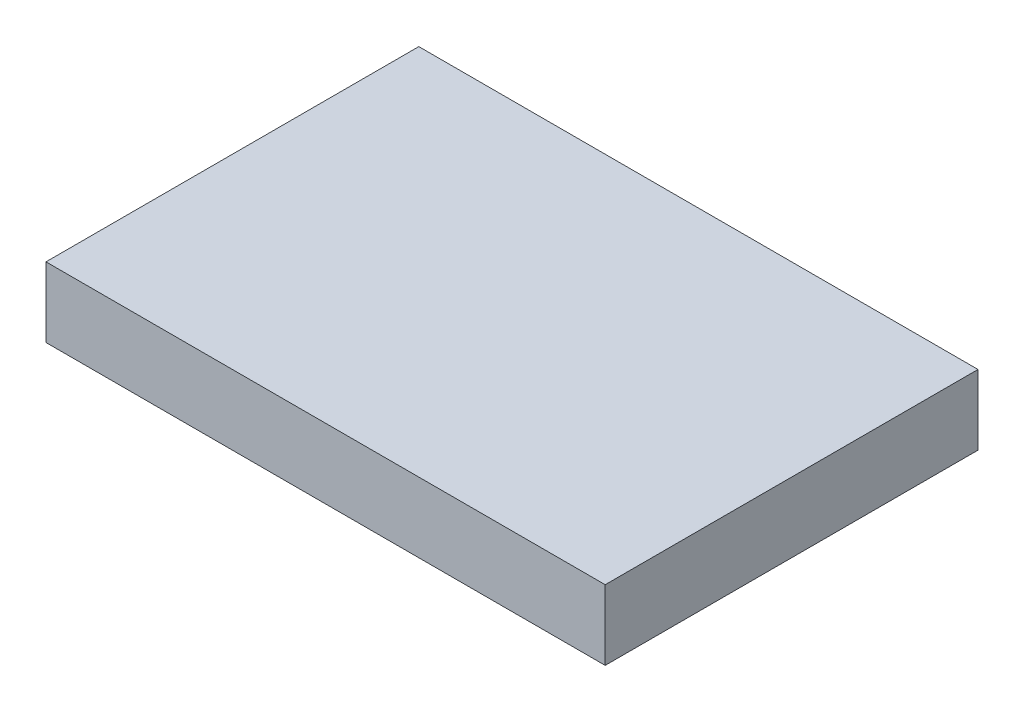
ISO-10303-21;
HEADER;
FILE_DESCRIPTION(('STEP AP214'),'2;1');
FILE_NAME('part.step','',(''),(''),'','','');
FILE_SCHEMA(('AUTOMOTIVE_DESIGN { 1 0 10303 214 1 1 1 1 }'));
ENDSEC;
DATA;
#1=APPLICATION_CONTEXT('core data for automotive mechanical design processes');
#2=APPLICATION_PROTOCOL_DEFINITION('international standard','automotive_design',2000,#1);
#3=PRODUCT_CONTEXT('',#1,'mechanical');
#4=PRODUCT('Part','Part','',(#3));
#5=PRODUCT_RELATED_PRODUCT_CATEGORY('part','',(#4));
#6=PRODUCT_DEFINITION_FORMATION('','',#4);
#7=PRODUCT_DEFINITION_CONTEXT('part definition',#1,'design');
#8=PRODUCT_DEFINITION('design','',#6,#7);
#9=PRODUCT_DEFINITION_SHAPE('','',#8);
#10=(LENGTH_UNIT() NAMED_UNIT(*) SI_UNIT(.MILLI.,.METRE.));
#11=(NAMED_UNIT(*) PLANE_ANGLE_UNIT() SI_UNIT($,.RADIAN.));
#12=(NAMED_UNIT(*) SI_UNIT($,.STERADIAN.) SOLID_ANGLE_UNIT());
#13=UNCERTAINTY_MEASURE_WITH_UNIT(LENGTH_MEASURE(1.E-05),#10,'distance_accuracy_value','');
#14=(GEOMETRIC_REPRESENTATION_CONTEXT(3) GLOBAL_UNCERTAINTY_ASSIGNED_CONTEXT((#13)) GLOBAL_UNIT_ASSIGNED_CONTEXT((#10,
#11,#12)) REPRESENTATION_CONTEXT('',''));
#15=CARTESIAN_POINT('',(0.,0.,0.));
#16=DIRECTION('',(0.,0.,1.));
#17=DIRECTION('',(1.,0.,0.));
#18=AXIS2_PLACEMENT_3D('',#15,#16,#17);
#19=CARTESIAN_POINT('',(-152.4,38.1,101.6));
#20=DIRECTION('',(0.,0.,-1.));
#21=DIRECTION('',(-1.,0.,0.));
#22=AXIS2_PLACEMENT_3D('',#19,#20,#21);
#23=PLANE('',#22);
#24=DIRECTION('',(1.,0.,0.));
#25=VECTOR('',#24,1.);
#26=CARTESIAN_POINT('',(-152.4,0.,101.6));
#27=LINE('',#26,#25);
#28=CARTESIAN_POINT('',(-152.4,0.,101.6));
#29=VERTEX_POINT('',#28);
#30=CARTESIAN_POINT('',(152.4,0.,101.6));
#31=VERTEX_POINT('',#30);
#32=EDGE_CURVE('E96',#29,#31,#27,.T.);
#33=ORIENTED_EDGE('',*,*,#32,.T.);
#34=DIRECTION('',(0.,-1.,0.));
#35=VECTOR('',#34,1.);
#36=CARTESIAN_POINT('',(152.4,38.1,101.6));
#37=LINE('',#36,#35);
#38=CARTESIAN_POINT('',(152.4,38.1,101.6));
#39=VERTEX_POINT('',#38);
#40=EDGE_CURVE('E11',#39,#31,#37,.T.);
#41=ORIENTED_EDGE('',*,*,#40,.F.);
#42=DIRECTION('',(1.,0.,0.));
#43=VECTOR('',#42,1.);
#44=CARTESIAN_POINT('',(-152.4,38.1,101.6));
#45=LINE('',#44,#43);
#46=CARTESIAN_POINT('',(-152.4,38.1,101.6));
#47=VERTEX_POINT('',#46);
#48=EDGE_CURVE('E73',#47,#39,#45,.T.);
#49=ORIENTED_EDGE('',*,*,#48,.F.);
#50=DIRECTION('',(0.,-1.,0.));
#51=VECTOR('',#50,1.);
#52=CARTESIAN_POINT('',(-152.4,38.1,101.6));
#53=LINE('',#52,#51);
#54=EDGE_CURVE('E92',#47,#29,#53,.T.);
#55=ORIENTED_EDGE('',*,*,#54,.T.);
#56=EDGE_LOOP('',(#33,#41,#49,#55));
#57=FACE_BOUND('',#56,.T.);
#58=ADVANCED_FACE('F34',(#57),#23,.F.);
#59=CARTESIAN_POINT('',(152.4,38.1,-101.6));
#60=DIRECTION('',(1.,0.,0.));
#61=DIRECTION('',(0.,0.,-1.));
#62=AXIS2_PLACEMENT_3D('',#59,#60,#61);
#63=PLANE('',#62);
#64=DIRECTION('',(0.,0.,1.));
#65=VECTOR('',#64,1.);
#66=CARTESIAN_POINT('',(152.4,0.,-101.6));
#67=LINE('',#66,#65);
#68=CARTESIAN_POINT('',(152.4,0.,-101.6));
#69=VERTEX_POINT('',#68);
#70=EDGE_CURVE('E82',#69,#31,#67,.T.);
#71=ORIENTED_EDGE('',*,*,#70,.F.);
#72=DIRECTION('',(0.,-1.,0.));
#73=VECTOR('',#72,1.);
#74=CARTESIAN_POINT('',(152.4,38.1,-101.6));
#75=LINE('',#74,#73);
#76=CARTESIAN_POINT('',(152.4,38.1,-101.6));
#77=VERTEX_POINT('',#76);
#78=EDGE_CURVE('E42',#77,#69,#75,.T.);
#79=ORIENTED_EDGE('',*,*,#78,.F.);
#80=DIRECTION('',(0.,0.,1.));
#81=VECTOR('',#80,1.);
#82=CARTESIAN_POINT('',(152.4,38.1,-101.6));
#83=LINE('',#82,#81);
#84=EDGE_CURVE('E80',#77,#39,#83,.T.);
#85=ORIENTED_EDGE('',*,*,#84,.T.);
#86=ORIENTED_EDGE('',*,*,#40,.T.);
#87=EDGE_LOOP('',(#71,#79,#85,#86));
#88=FACE_BOUND('',#87,.T.);
#89=ADVANCED_FACE('F79',(#88),#63,.T.);
#90=CARTESIAN_POINT('',(-152.4,38.1,-101.6));
#91=DIRECTION('',(0.,0.,-1.));
#92=DIRECTION('',(-1.,0.,0.));
#93=AXIS2_PLACEMENT_3D('',#90,#91,#92);
#94=PLANE('',#93);
#95=DIRECTION('',(1.,0.,0.));
#96=VECTOR('',#95,1.);
#97=CARTESIAN_POINT('',(-152.4,0.,-101.6));
#98=LINE('',#97,#96);
#99=CARTESIAN_POINT('',(-152.4,0.,-101.6));
#100=VERTEX_POINT('',#99);
#101=EDGE_CURVE('E100',#100,#69,#98,.T.);
#102=ORIENTED_EDGE('',*,*,#101,.F.);
#103=DIRECTION('',(0.,-1.,0.));
#104=VECTOR('',#103,1.);
#105=CARTESIAN_POINT('',(-152.4,38.1,-101.6));
#106=LINE('',#105,#104);
#107=CARTESIAN_POINT('',(-152.4,38.1,-101.6));
#108=VERTEX_POINT('',#107);
#109=EDGE_CURVE('E65',#108,#100,#106,.T.);
#110=ORIENTED_EDGE('',*,*,#109,.F.);
#111=DIRECTION('',(1.,0.,0.));
#112=VECTOR('',#111,1.);
#113=CARTESIAN_POINT('',(-152.4,38.1,-101.6));
#114=LINE('',#113,#112);
#115=EDGE_CURVE('E88',#108,#77,#114,.T.);
#116=ORIENTED_EDGE('',*,*,#115,.T.);
#117=ORIENTED_EDGE('',*,*,#78,.T.);
#118=EDGE_LOOP('',(#102,#110,#116,#117));
#119=FACE_BOUND('',#118,.T.);
#120=ADVANCED_FACE('F90',(#119),#94,.T.);
#121=CARTESIAN_POINT('',(-152.4,38.1,-101.6));
#122=DIRECTION('',(1.,0.,0.));
#123=DIRECTION('',(0.,0.,-1.));
#124=AXIS2_PLACEMENT_3D('',#121,#122,#123);
#125=PLANE('',#124);
#126=DIRECTION('',(0.,0.,1.));
#127=VECTOR('',#126,1.);
#128=CARTESIAN_POINT('',(-152.4,0.,-101.6));
#129=LINE('',#128,#127);
#130=EDGE_CURVE('E68',#100,#29,#129,.T.);
#131=ORIENTED_EDGE('',*,*,#130,.T.);
#132=ORIENTED_EDGE('',*,*,#54,.F.);
#133=DIRECTION('',(0.,0.,1.));
#134=VECTOR('',#133,1.);
#135=CARTESIAN_POINT('',(-152.4,38.1,-101.6));
#136=LINE('',#135,#134);
#137=EDGE_CURVE('E50',#108,#47,#136,.T.);
#138=ORIENTED_EDGE('',*,*,#137,.F.);
#139=ORIENTED_EDGE('',*,*,#109,.T.);
#140=EDGE_LOOP('',(#131,#132,#138,#139));
#141=FACE_BOUND('',#140,.T.);
#142=ADVANCED_FACE('F113',(#141),#125,.F.);
#143=CARTESIAN_POINT('',(0.,38.1,0.));
#144=DIRECTION('',(0.,-1.,0.));
#145=DIRECTION('',(0.,0.,-1.));
#146=AXIS2_PLACEMENT_3D('',#143,#144,#145);
#147=PLANE('',#146);
#148=ORIENTED_EDGE('',*,*,#48,.T.);
#149=ORIENTED_EDGE('',*,*,#84,.F.);
#150=ORIENTED_EDGE('',*,*,#115,.F.);
#151=ORIENTED_EDGE('',*,*,#137,.T.);
#152=EDGE_LOOP('',(#148,#149,#150,#151));
#153=FACE_BOUND('',#152,.T.);
#154=ADVANCED_FACE('F87',(#153),#147,.F.);
#155=CARTESIAN_POINT('',(0.,0.,0.));
#156=DIRECTION('',(0.,-1.,0.));
#157=DIRECTION('',(0.,0.,-1.));
#158=AXIS2_PLACEMENT_3D('',#155,#156,#157);
#159=PLANE('',#158);
#160=ORIENTED_EDGE('',*,*,#32,.F.);
#161=ORIENTED_EDGE('',*,*,#130,.F.);
#162=ORIENTED_EDGE('',*,*,#101,.T.);
#163=ORIENTED_EDGE('',*,*,#70,.T.);
#164=EDGE_LOOP('',(#160,#161,#162,#163));
#165=FACE_BOUND('',#164,.T.);
#166=ADVANCED_FACE('F107',(#165),#159,.T.);
#167=CLOSED_SHELL('',(#58,#89,#120,#142,#154,#166));
#168=MANIFOLD_SOLID_BREP('B2',#167);
#169=ADVANCED_BREP_SHAPE_REPRESENTATION('',(#18,#168),#14);
#170=SHAPE_DEFINITION_REPRESENTATION(#9,#169);
ENDSEC;
END-ISO-10303-21;
